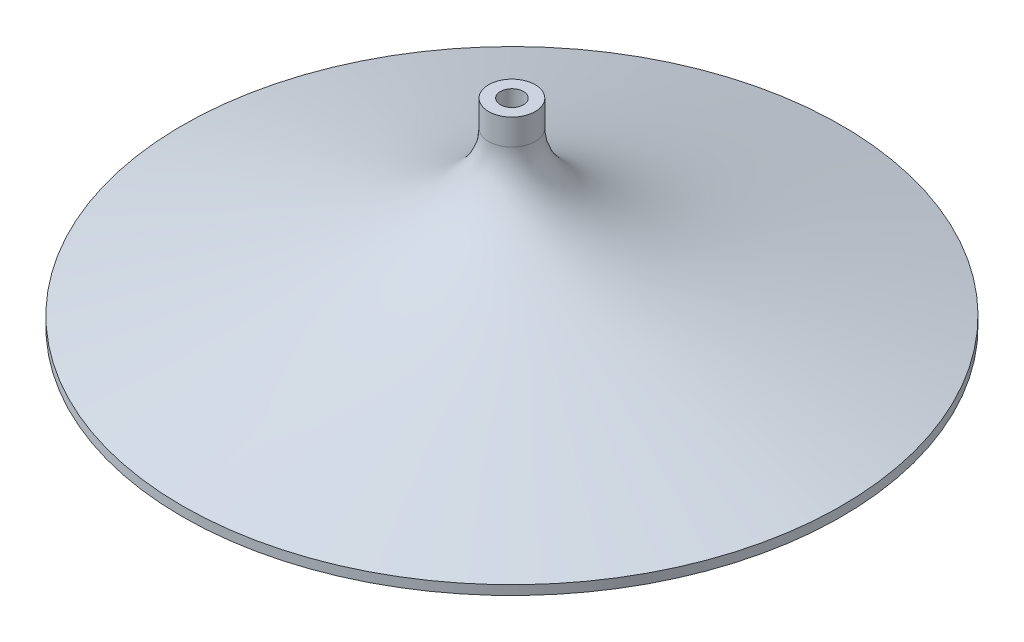
ISO-10303-21;
HEADER;
FILE_DESCRIPTION(('STEP AP214'),'2;1');
FILE_NAME('part.step','',(''),(''),'','','');
FILE_SCHEMA(('AUTOMOTIVE_DESIGN { 1 0 10303 214 1 1 1 1 }'));
ENDSEC;
DATA;
#1=APPLICATION_CONTEXT('core data for automotive mechanical design processes');
#2=APPLICATION_PROTOCOL_DEFINITION('international standard','automotive_design',2000,#1);
#3=PRODUCT_CONTEXT('',#1,'mechanical');
#4=PRODUCT('Part','Part','',(#3));
#5=PRODUCT_RELATED_PRODUCT_CATEGORY('part','',(#4));
#6=PRODUCT_DEFINITION_FORMATION('','',#4);
#7=PRODUCT_DEFINITION_CONTEXT('part definition',#1,'design');
#8=PRODUCT_DEFINITION('design','',#6,#7);
#9=PRODUCT_DEFINITION_SHAPE('','',#8);
#10=(LENGTH_UNIT() NAMED_UNIT(*) SI_UNIT(.MILLI.,.METRE.));
#11=(NAMED_UNIT(*) PLANE_ANGLE_UNIT() SI_UNIT($,.RADIAN.));
#12=(NAMED_UNIT(*) SI_UNIT($,.STERADIAN.) SOLID_ANGLE_UNIT());
#13=UNCERTAINTY_MEASURE_WITH_UNIT(LENGTH_MEASURE(1.E-05),#10,'distance_accuracy_value','');
#14=(GEOMETRIC_REPRESENTATION_CONTEXT(3) GLOBAL_UNCERTAINTY_ASSIGNED_CONTEXT((#13)) GLOBAL_UNIT_ASSIGNED_CONTEXT((#10,
#11,#12)) REPRESENTATION_CONTEXT('',''));
#15=CARTESIAN_POINT('',(0.,0.,0.));
#16=DIRECTION('',(0.,0.,1.));
#17=DIRECTION('',(1.,0.,0.));
#18=AXIS2_PLACEMENT_3D('',#15,#16,#17);
#19=CARTESIAN_POINT('',(3.5,41.1639123009446,0.));
#20=CARTESIAN_POINT('',(3.49999999999997,40.9287658009663,0.));
#21=CARTESIAN_POINT('',(9.43857005007433,32.1160632800598,0.));
#22=CARTESIAN_POINT('',(43.1197069964458,15.0735828836422,0.));
#23=CARTESIAN_POINT('',(90.3127625250122,0.,0.));
#24=CARTESIAN_POINT('',(100.,0.,0.));
#25=B_SPLINE_CURVE_WITH_KNOTS('',3,(#19,#20,#21,#22,#23,#24),.UNSPECIFIED.,.F.,.F.,(4,1,1,4),
(0.,0.258531262544246,0.358531262544246,1.),.UNSPECIFIED.);
#26=CARTESIAN_POINT('',(0.,82.9200333058916,0.));
#27=DIRECTION('',(0.,1.,0.));
#28=AXIS1_PLACEMENT('',#26,#27);
#29=SURFACE_OF_REVOLUTION('',#25,#28);
#30=CARTESIAN_POINT('',(0.,0.,0.));
#31=DIRECTION('',(0.,1.,0.));
#32=DIRECTION('',(0.,0.,1.));
#33=AXIS2_PLACEMENT_3D('',#30,#31,#32);
#34=CIRCLE('',#33,100.);
#35=CARTESIAN_POINT('',(0.,0.,100.));
#36=VERTEX_POINT('',#35);
#37=EDGE_CURVE('E44',#36,#36,#34,.T.);
#38=ORIENTED_EDGE('',*,*,#37,.F.);
#39=EDGE_LOOP('',(#38));
#40=FACE_BOUND('',#39,.T.);
#41=CARTESIAN_POINT('',(0.,41.1639123009446,0.));
#42=DIRECTION('',(0.,1.,0.));
#43=DIRECTION('',(0.,0.,1.));
#44=AXIS2_PLACEMENT_3D('',#41,#42,#43);
#45=CIRCLE('',#44,3.5);
#46=CARTESIAN_POINT('',(0.,41.1639123009446,3.5));
#47=VERTEX_POINT('',#46);
#48=EDGE_CURVE('E49',#47,#47,#45,.T.);
#49=ORIENTED_EDGE('',*,*,#48,.T.);
#50=EDGE_LOOP('',(#49));
#51=FACE_BOUND('',#50,.T.);
#52=CARTESIAN_POINT('',(-50.,7.74931137944669,47.));
#53=CARTESIAN_POINT('',(-49.8371933999192,7.78743607054464,47.0000070376987));
#54=CARTESIAN_POINT('',(-49.6736400864839,7.82278170177511,47.0132897353084));
#55=CARTESIAN_POINT('',(-49.3495140158562,7.88663733892453,47.066763295319));
#56=CARTESIAN_POINT('',(-49.1889432280433,7.91514296671415,47.1069713299351));
#57=CARTESIAN_POINT('',(-48.8752651920754,7.96421963684058,47.213881640766));
#58=CARTESIAN_POINT('',(-48.7221697942277,7.98477841686328,47.2806245420512));
#59=CARTESIAN_POINT('',(-48.4285050258245,8.01700531047959,47.4390964856618));
#60=CARTESIAN_POINT('',(-48.2879321049657,8.02867595111864,47.5308184159589));
#61=CARTESIAN_POINT('',(-48.0277796406657,8.04239333431842,47.7335670025724));
#62=CARTESIAN_POINT('',(-47.9076930782927,8.04472095070251,47.8439245601739));
#63=CARTESIAN_POINT('',(-47.6870571782945,8.04042487013625,48.0825297239788));
#64=CARTESIAN_POINT('',(-47.5865060945378,8.03380197362724,48.2107757295045));
#65=CARTESIAN_POINT('',(-47.4091170317056,8.01206614657978,48.4792064289043));
#66=CARTESIAN_POINT('',(-47.3319373859919,7.99708567306985,48.6191765966015));
#67=CARTESIAN_POINT('',(-47.2010226019104,7.95934104526324,48.9086839439501));
#68=CARTESIAN_POINT('',(-47.1472889343607,7.93657640280817,49.0582217231243));
#69=CARTESIAN_POINT('',(-47.0633645488106,7.88358413411348,49.3658729798267));
#70=CARTESIAN_POINT('',(-47.0336811680985,7.85321254479572,49.5240996166637));
#71=CARTESIAN_POINT('',(-46.9999017850467,7.78635127947534,49.8419700805924));
#72=CARTESIAN_POINT('',(-46.9958107561781,7.74986041570267,50.001614177109));
#73=CARTESIAN_POINT('',(-47.0131087052758,7.6701785173301,50.3255019234452));
#74=CARTESIAN_POINT('',(-47.0356580889196,7.62675914109373,50.4896271801748));
#75=CARTESIAN_POINT('',(-47.1069878497364,7.53590563625835,50.8109124802167));
#76=CARTESIAN_POINT('',(-47.1557745199752,7.48847054678329,50.9680708427128));
#77=CARTESIAN_POINT('',(-47.2808959547778,7.38857426018312,51.2790221345277));
#78=CARTESIAN_POINT('',(-47.3584530164055,7.33598085799161,51.4322813706433));
#79=CARTESIAN_POINT('',(-47.5382258039769,7.22939277170783,51.7230495062454));
#80=CARTESIAN_POINT('',(-47.6404462898835,7.17539781891807,51.8605553578143));
#81=CARTESIAN_POINT('',(-47.8702534856856,7.06581058147329,52.1201745317555));
#82=CARTESIAN_POINT('',(-47.9985227383986,7.01022016117296,52.2416855288685));
#83=CARTESIAN_POINT('',(-48.2748008670827,6.90065577384512,52.4606418789994));
#84=CARTESIAN_POINT('',(-48.4228108682062,6.84668189916985,52.5580858593797));
#85=CARTESIAN_POINT('',(-48.7346112136652,6.74182640087181,52.7258284834378));
#86=CARTESIAN_POINT('',(-48.8984089914099,6.69094625244589,52.7961142613542));
#87=CARTESIAN_POINT('',(-49.2370996249496,6.59376584644928,52.9068386477738));
#88=CARTESIAN_POINT('',(-49.4119910632492,6.54746500568341,52.9472810612118));
#89=CARTESIAN_POINT('',(-49.7626241552213,6.46205417794045,52.9956782508579));
#90=CARTESIAN_POINT('',(-49.9382029355796,6.42277830760406,53.004516499712));
#91=CARTESIAN_POINT('',(-50.2895867013484,6.35105173753287,52.9911579321347));
#92=CARTESIAN_POINT('',(-50.4653916177128,6.31859930108163,52.9689690238348));
#93=CARTESIAN_POINT('',(-50.8041517294162,6.26277740580056,52.8951861648044));
#94=CARTESIAN_POINT('',(-50.9673350705913,6.23907929180808,52.8448881780332));
#95=CARTESIAN_POINT('',(-51.2836000002297,6.19962880755189,52.7168823419498));
#96=CARTESIAN_POINT('',(-51.4366840865841,6.18387446606922,52.6391813007495));
#97=CARTESIAN_POINT('',(-51.7222394944673,6.16126085266228,52.4619209045582));
#98=CARTESIAN_POINT('',(-51.8552744769774,6.15408508895662,52.363308799744));
#99=CARTESIAN_POINT('',(-52.1034112005326,6.14777501579681,52.1454391095434));
#100=CARTESIAN_POINT('',(-52.2185154152126,6.14863959613816,52.0261843767066));
#101=CARTESIAN_POINT('',(-52.4254528736472,6.15828945824554,51.7729691789806));
#102=CARTESIAN_POINT('',(-52.5176804519469,6.16692656448727,51.6393248257427));
#103=CARTESIAN_POINT('',(-52.679173343367,6.19165734333051,51.3594600331875));
#104=CARTESIAN_POINT('',(-52.7484386985152,6.20775100228415,51.2132396168887));
#105=CARTESIAN_POINT('',(-52.8627846903166,6.24706062640485,50.9114187763394));
#106=CARTESIAN_POINT('',(-52.9077006836285,6.27032345006441,50.755762218745));
#107=CARTESIAN_POINT('',(-52.9718732136436,6.32328435205716,50.4403192114138));
#108=CARTESIAN_POINT('',(-52.9911267765077,6.35298317574975,50.2805322852242));
#109=CARTESIAN_POINT('',(-53.0041911898799,6.41896128838622,49.9565002467073));
#110=CARTESIAN_POINT('',(-52.9972524269038,6.45540562521037,49.7922594321927));
#111=CARTESIAN_POINT('',(-52.9569955960585,6.53333126899884,49.4681930891525));
#112=CARTESIAN_POINT('',(-52.9236725241946,6.5748135301821,49.3083684041323));
#113=CARTESIAN_POINT('',(-52.8540887721523,6.64087095188915,49.0719225319284));
#114=CARTESIAN_POINT('',(-52.8268815158635,6.66402646912765,48.9921184693883));
#115=CARTESIAN_POINT('',(-52.7659660377993,6.71126284305826,48.8353124880021));
#116=CARTESIAN_POINT('',(-52.7322590628655,6.73534352156828,48.7583100350851));
#117=CARTESIAN_POINT('',(-52.6586271444782,6.78427063236927,48.607615953116));
#118=CARTESIAN_POINT('',(-52.6187035461807,6.80911689807135,48.5339236122544));
#119=CARTESIAN_POINT('',(-52.5329168285918,6.85944005870036,48.3902338149446));
#120=CARTESIAN_POINT('',(-52.4870483297631,6.88491750768637,48.3202397868482));
#121=CARTESIAN_POINT('',(-52.3373349105849,6.96399073145484,48.11137758949));
#122=CARTESIAN_POINT('',(-52.2241604498708,7.01837898552972,47.9793331278455));
#123=CARTESIAN_POINT('',(-51.9768693618744,7.1276684991698,47.736819475004));
#124=CARTESIAN_POINT('',(-51.842750599346,7.18256981050346,47.6263524861916));
#125=CARTESIAN_POINT('',(-51.6272200652164,7.26470476951149,47.4780954056335));
#126=CARTESIAN_POINT('',(-51.5520951338072,7.29234318297422,47.4311767579379));
#127=CARTESIAN_POINT('',(-51.3979125673315,7.34713331196661,47.3441266400534));
#128=CARTESIAN_POINT('',(-51.3188584758221,7.37428543703709,47.3039891929116));
#129=CARTESIAN_POINT('',(-51.15736746953,7.42789371240121,47.2308205021526));
#130=CARTESIAN_POINT('',(-51.0749327063049,7.454350288292,47.1977848198416));
#131=CARTESIAN_POINT('',(-50.9072178854327,7.50636926606877,47.1390818573836));
#132=CARTESIAN_POINT('',(-50.8219378921303,7.53193168814921,47.1134144107306));
#133=CARTESIAN_POINT('',(-50.616102670703,7.59150430953714,47.061365572369));
#134=CARTESIAN_POINT('',(-50.4945046171052,7.62501587159943,47.0384493036012));
#135=CARTESIAN_POINT('',(-50.2487500434827,7.68933116788484,47.0077642955096));
#136=CARTESIAN_POINT('',(-50.124593683057,7.72013507039691,46.9999946141447));
#137=CARTESIAN_POINT('',(-50.,7.74931137944669,47.));
#138=B_SPLINE_CURVE_WITH_KNOTS('',3,(#52,#53,#54,#55,#56,#57,#58,#59,#60,#61,#62,#63,#64,#65,
#66,#67,#68,#69,#70,#71,#72,#73,#74,#75,#76,#77,#78,#79,#80,#81,#82,#83,#84,#85,#86,#87,#88,#89,
#90,#91,#92,#93,#94,#95,#96,#97,#98,#99,#100,#101,#102,#103,#104,#105,#106,#107,#108,#109,#110,
#111,#112,#113,#114,#115,#116,#117,#118,#119,#120,#121,#122,#123,#124,#125,#126,#127,#128,#129,
#130,#131,#132,#133,#134,#135,#136,#137),.UNSPECIFIED.,.T.,.F.,(4,2,2,2,2,2,2,2,2,2,2,2,2,2,2,2,
2,2,2,2,2,2,2,2,2,2,2,2,2,2,2,2,2,2,2,2,2,2,2,2,2,2,4),(0.,0.501213052798379,1.00274606987385,
1.5050499129044,2.00721088925107,2.49415726599421,2.98106009816822,3.46045679638913,
3.93988356390269,4.42917814841365,4.91856781667772,5.43008454748125,5.94172402135124,
6.47819982954571,7.01477925880777,7.56783565474552,8.12092358641026,8.67427321428396,
9.22755227963173,9.76523835019697,10.3027874015308,10.8173846225678,11.3318540852102,
11.8266915822709,12.321460753567,12.8069929164671,13.2925241906926,13.7812987874475,
14.2701300199414,14.7730560448954,15.2760774766364,15.5381425439692,15.8001573892586,
16.0621156182232,16.3243125700271,16.8682959232092,17.4123347710845,17.690408349697,
17.9682355408278,18.2458885782744,18.5235353408744,18.9071307511808,19.2907023030306),.UNSPECIFIED.);
#139=CARTESIAN_POINT('',(-50.,7.74931137944669,47.));
#140=VERTEX_POINT('',#139);
#141=EDGE_CURVE('E53',#140,#140,#138,.T.);
#142=ORIENTED_EDGE('',*,*,#141,.F.);
#143=EDGE_LOOP('',(#142));
#144=FACE_BOUND('',#143,.T.);
#145=CARTESIAN_POINT('',(50.,7.7493113794467,47.));
#146=CARTESIAN_POINT('',(50.1747667684297,7.70838254744763,47.000008455201));
#147=CARTESIAN_POINT('',(50.3489428781283,7.66418595198038,47.0153258446435));
#148=CARTESIAN_POINT('',(50.6909620175949,7.57088094981209,47.0754780929659));
#149=CARTESIAN_POINT('',(50.8587927892712,7.52176364443276,47.1203672777496));
#150=CARTESIAN_POINT('',(51.1830467747229,7.42036740942037,47.2377455024459));
#151=CARTESIAN_POINT('',(51.3394934924482,7.36809542657404,47.31017563604));
#152=CARTESIAN_POINT('',(51.637242243745,7.26186392397923,47.4803095734476));
#153=CARTESIAN_POINT('',(51.7785491241948,7.20790495149413,47.5780052543327));
#154=CARTESIAN_POINT('',(52.0459219903683,7.09833208547208,47.7988528847746));
#155=CARTESIAN_POINT('',(52.1714876297335,7.04271208306603,47.9226083440171));
#156=CARTESIAN_POINT('',(52.3993140935614,6.93277902294952,48.1905199566071));
#157=CARTESIAN_POINT('',(52.5015714736827,6.87846615945874,48.3346791199846));
#158=CARTESIAN_POINT('',(52.6799067021275,6.77245932078712,48.6400466282073));
#159=CARTESIAN_POINT('',(52.7558871173539,6.72077568587491,48.8013155881786));
#160=CARTESIAN_POINT('',(52.878389496379,6.62171840568605,49.1359369617584));
#161=CARTESIAN_POINT('',(52.924914861484,6.57434426331427,49.3092879776305));
#162=CARTESIAN_POINT('',(52.9856091901037,6.48646631843449,49.6583715734811));
#163=CARTESIAN_POINT('',(53.0005827722363,6.44581667820688,49.8339270199133));
#164=CARTESIAN_POINT('',(52.9993829507737,6.37116904873648,50.1863543438737));
#165=CARTESIAN_POINT('',(52.9832173423997,6.3371693971175,50.3632258808977));
#166=CARTESIAN_POINT('',(52.9208865040616,6.27817536706732,50.7052369922649));
#167=CARTESIAN_POINT('',(52.8760132016697,6.25286207088197,50.870556963971));
#168=CARTESIAN_POINT('',(52.7583262194443,6.21012128713429,51.1920189251059));
#169=CARTESIAN_POINT('',(52.6855196109414,6.19269180621138,51.3481632258334));
#170=CARTESIAN_POINT('',(52.5172652313949,6.16680373193512,51.6403271790651));
#171=CARTESIAN_POINT('',(52.4228223583421,6.15801879220589,51.7768972993104));
#172=CARTESIAN_POINT('',(52.212544115855,6.14851671982099,52.0327454205958));
#173=CARTESIAN_POINT('',(52.0967120042039,6.14779835957748,52.1520260500572));
#174=CARTESIAN_POINT('',(51.8497253108415,6.15437912850062,52.3674478446786));
#175=CARTESIAN_POINT('',(51.7189437299103,6.16151014904793,52.4640224677885));
#176=CARTESIAN_POINT('',(51.4439860896936,6.18330797209017,52.6345925359432));
#177=CARTESIAN_POINT('',(51.299810216223,6.19797467005769,52.7085882941569));
#178=CARTESIAN_POINT('',(51.0016061631091,6.2344930046678,52.8324840866406));
#179=CARTESIAN_POINT('',(50.8475391829702,6.25637452997317,52.8822817163447));
#180=CARTESIAN_POINT('',(50.5344411321874,6.30668872723654,52.9563936822727));
#181=CARTESIAN_POINT('',(50.3754095427275,6.3351220858749,52.9807053458965));
#182=CARTESIAN_POINT('',(50.0523436486466,6.39862850385429,53.0040290442243));
#183=CARTESIAN_POINT('',(49.8882902323577,6.43386014649554,53.0023400608364));
#184=CARTESIAN_POINT('',(49.5638193790384,6.50949708046443,52.9725922506907));
#185=CARTESIAN_POINT('',(49.4034026101037,6.54990331350464,52.9445286181602));
#186=CARTESIAN_POINT('',(49.0838910786966,6.63659506062347,52.8616544502913));
#187=CARTESIAN_POINT('',(48.9251111245444,6.68305207007709,52.8058098757514));
#188=CARTESIAN_POINT('',(48.6198859020658,6.77927275642507,52.668946777022));
#189=CARTESIAN_POINT('',(48.4734431904209,6.82903711490706,52.587923051118));
#190=CARTESIAN_POINT('',(48.1910010213732,6.93264564780772,52.3994721024694));
#191=CARTESIAN_POINT('',(48.0556441004194,6.98657334025611,52.291126959905));
#192=CARTESIAN_POINT('',(47.805686447347,7.09522694233373,52.052997252044));
#193=CARTESIAN_POINT('',(47.6910891508053,7.14995298246775,51.9232091448654));
#194=CARTESIAN_POINT('',(47.4834051194979,7.2599568698203,51.6425319540849));
#195=CARTESIAN_POINT('',(47.3908669600591,7.31521895384398,51.491230054281));
#196=CARTESIAN_POINT('',(47.233585836359,7.42337349657864,51.1740076953411));
#197=CARTESIAN_POINT('',(47.1688437080802,7.4762658839767,51.0080867967107));
#198=CARTESIAN_POINT('',(47.069839468038,7.57762280871161,50.6673922201839));
#199=CARTESIAN_POINT('',(47.0353742381982,7.62611486523826,50.4926859811529));
#200=CARTESIAN_POINT('',(46.9979111102729,7.71734319491259,50.138437045084));
#201=CARTESIAN_POINT('',(46.9949072640919,7.76008055453612,49.9588952686891));
#202=CARTESIAN_POINT('',(47.0207946217864,7.83663344417114,49.6072603025964));
#203=CARTESIAN_POINT('',(47.0484957871213,7.87072311803398,49.4351399297963));
#204=CARTESIAN_POINT('',(47.1338330637783,7.93056845057196,49.0969696040681));
#205=CARTESIAN_POINT('',(47.1914589174058,7.95632696012721,48.9309175918689));
#206=CARTESIAN_POINT('',(47.3316809418968,7.99724485326316,48.6187590869052));
#207=CARTESIAN_POINT('',(47.4128303186408,8.01288382399448,48.4720650884831));
#208=CARTESIAN_POINT('',(47.5988269294557,8.03491348133624,48.1938028500749));
#209=CARTESIAN_POINT('',(47.7036666980698,8.04130707671786,48.0622298647278));
#210=CARTESIAN_POINT('',(47.9294421284225,8.04449397016599,47.8231252551286));
#211=CARTESIAN_POINT('',(48.0495974251072,8.04164938827148,47.714860035955));
#212=CARTESIAN_POINT('',(48.305425667006,8.02727166971802,47.5192042386191));
#213=CARTESIAN_POINT('',(48.4411017471766,8.01573677511386,47.4318178887112));
#214=CARTESIAN_POINT('',(48.7232643826047,7.98453898018476,47.2805379371435));
#215=CARTESIAN_POINT('',(48.8696990257278,7.96491324342108,47.2165394115806));
#216=CARTESIAN_POINT('',(49.1696658373187,7.91832195661821,47.1128424615041));
#217=CARTESIAN_POINT('',(49.3231896811721,7.89136484232466,47.0731162778845));
#218=CARTESIAN_POINT('',(49.564634198632,7.84444338493509,47.0304557620372));
#219=CARTESIAN_POINT('',(49.6515718249299,7.82665147220695,47.0190208187454));
#220=CARTESIAN_POINT('',(49.8257218420074,7.78928043917538,47.0037910388814));
#221=CARTESIAN_POINT('',(49.9129342176214,7.76970141590419,46.999995787765));
#222=CARTESIAN_POINT('',(50.,7.7493113794467,47.));
#223=B_SPLINE_CURVE_WITH_KNOTS('',3,(#145,#146,#147,#148,#149,#150,#151,#152,#153,#154,#155,
#156,#157,#158,#159,#160,#161,#162,#163,#164,#165,#166,#167,#168,#169,#170,#171,#172,#173,#174,
#175,#176,#177,#178,#179,#180,#181,#182,#183,#184,#185,#186,#187,#188,#189,#190,#191,#192,#193,
#194,#195,#196,#197,#198,#199,#200,#201,#202,#203,#204,#205,#206,#207,#208,#209,#210,#211,#212,
#213,#214,#215,#216,#217,#218,#219,#220,#221,#222),.UNSPECIFIED.,.T.,.F.,(4,2,2,2,2,2,2,2,2,2,2,
2,2,2,2,2,2,2,2,2,2,2,2,2,2,2,2,2,2,2,2,2,2,2,2,2,2,2,4),(0.,0.538144826140719,1.07728103737207,
1.61527053804346,2.15308728847935,2.70509058972405,3.2571754095828,3.81128590759263,
4.36533240831263,4.90506984913645,5.44467219248547,5.96155226299459,6.47830157129723,
6.97469434165276,7.47101156896193,7.95690252186998,8.44278673516408,8.93070964211363,
9.41868371025408,9.91983683546959,10.421081294416,10.9425610550852,11.4641486189982,
12.0063753813257,12.5486917966874,13.1033438565081,13.6580125966579,14.2089311817358,
14.7597456081542,15.2899358289865,15.8199444291196,16.3225207227517,16.8249388618796,
17.3079043610925,17.7909675846279,18.2718362540317,18.7521539426954,19.0202629392438,
19.288357387301),.UNSPECIFIED.);
#224=CARTESIAN_POINT('',(50.,7.7493113794467,47.));
#225=VERTEX_POINT('',#224);
#226=EDGE_CURVE('E61',#225,#225,#223,.T.);
#227=ORIENTED_EDGE('',*,*,#226,.F.);
#228=EDGE_LOOP('',(#227));
#229=FACE_BOUND('',#228,.T.);
#230=CARTESIAN_POINT('',(49.9999999999997,6.41064462199854,-53.));
#231=CARTESIAN_POINT('',(50.1634225291492,6.37590807711266,-52.9999922921613));
#232=CARTESIAN_POINT('',(50.3275479154709,6.34400083899074,-52.9866054988192));
#233=CARTESIAN_POINT('',(50.6525927636919,6.28675220878911,-52.9327968603186));
#234=CARTESIAN_POINT('',(50.8135098028635,6.26141561707004,-52.8923553263786));
#235=CARTESIAN_POINT('',(51.1275251295454,6.21804261276954,-52.7850017518029));
#236=CARTESIAN_POINT('',(51.2806152428631,6.20001370128831,-52.7180626508272));
#237=CARTESIAN_POINT('',(51.5740783005077,6.17185406464985,-52.5593159386341));
#238=CARTESIAN_POINT('',(51.7144542941551,6.16172144121125,-52.4675143115665));
#239=CARTESIAN_POINT('',(51.9752286549594,6.14980114895252,-52.2638970406924));
#240=CARTESIAN_POINT('',(52.0960016230294,6.14783305474838,-52.1525714433463));
#241=CARTESIAN_POINT('',(52.3177153359826,6.15180617042391,-51.9117984470763));
#242=CARTESIAN_POINT('',(52.4186573028115,6.15774689280301,-51.7823521655539));
#243=CARTESIAN_POINT('',(52.5969528115745,6.17725113740893,-51.5106188387372));
#244=CARTESIAN_POINT('',(52.6745435963128,6.19073371507005,-51.3684813955105));
#245=CARTESIAN_POINT('',(52.8056641057531,6.2248680364192,-51.0743291871089));
#246=CARTESIAN_POINT('',(52.8591929322321,6.24552004768827,-50.9223140534462));
#247=CARTESIAN_POINT('',(52.9417314526904,6.29376262661139,-50.6104226223553));
#248=CARTESIAN_POINT('',(52.9703733318404,6.32144971237671,-50.4504641626842));
#249=CARTESIAN_POINT('',(53.0015621267547,6.38284684785618,-50.1291795914688));
#250=CARTESIAN_POINT('',(53.0041053253652,6.41655775482875,-49.9678532883815));
#251=CARTESIAN_POINT('',(52.9832361396604,6.49036982589213,-49.6425677289396));
#252=CARTESIAN_POINT('',(52.9589357460129,6.53064969315653,-49.4787062700501));
#253=CARTESIAN_POINT('',(52.8841947849241,6.61566701690998,-49.1582729653907));
#254=CARTESIAN_POINT('',(52.8337489859704,6.660405364062,-49.0017025853505));
#255=CARTESIAN_POINT('',(52.7058638953489,6.75518155843769,-48.6933601897619));
#256=CARTESIAN_POINT('',(52.6273810575099,6.80536298521645,-48.5420649542647));
#257=CARTESIAN_POINT('',(52.4464667401916,6.90806349053455,-48.2554253218611));
#258=CARTESIAN_POINT('',(52.344030515418,6.96058303059537,-48.1200840935301));
#259=CARTESIAN_POINT('',(52.1141985994346,7.06844729438541,-47.8644176192505));
#260=CARTESIAN_POINT('',(51.9860652541747,7.12382704313385,-47.7447694436418));
#261=CARTESIAN_POINT('',(51.7108293851384,7.23412272133619,-47.5294533686839));
#262=CARTESIAN_POINT('',(51.5637245555654,7.28903859354462,-47.4337883884227));
#263=CARTESIAN_POINT('',(51.2527335627108,7.39743237707183,-47.2683283020841));
#264=CARTESIAN_POINT('',(51.0886747855917,7.45088667366547,-47.1988414321605));
#265=CARTESIAN_POINT('',(50.7497480675867,7.55398016087717,-47.0897488107115));
#266=CARTESIAN_POINT('',(50.5748807319765,7.60361956477933,-47.0501413875844));
#267=CARTESIAN_POINT('',(50.2230463356254,7.69636420049075,-47.0031514674689));
#268=CARTESIAN_POINT('',(50.0461955720675,7.7395824076344,-46.9951257813196));
#269=CARTESIAN_POINT('',(49.6922776829214,7.81901325779093,-47.0105766138363));
#270=CARTESIAN_POINT('',(49.5152106312128,7.85522784641245,-47.0340443691849));
#271=CARTESIAN_POINT('',(49.1747010515462,7.9176167252325,-47.1107240665286));
#272=CARTESIAN_POINT('',(49.0110076535077,7.94417912930651,-47.1625043369528));
#273=CARTESIAN_POINT('',(48.6938653195417,7.98836922741689,-47.2938153017));
#274=CARTESIAN_POINT('',(48.5404129065754,8.00599996748677,-47.3733365196719));
#275=CARTESIAN_POINT('',(48.2561333833027,8.03087300728261,-47.5534045355803));
#276=CARTESIAN_POINT('',(48.1245612961922,8.03858752537287,-47.6527117380442));
#277=CARTESIAN_POINT('',(47.8793505974805,8.04486672164719,-47.8716564795552));
#278=CARTESIAN_POINT('',(47.7657086174572,8.0434331205361,-47.9912901911908));
#279=CARTESIAN_POINT('',(47.5624159646463,8.03164058962183,-48.2439259251785));
#280=CARTESIAN_POINT('',(47.4722190502732,8.02151433397063,-48.3765002683347));
#281=CARTESIAN_POINT('',(47.3143530309203,7.99307341491962,-48.6536227417015));
#282=CARTESIAN_POINT('',(47.2466842469561,7.97475863484575,-48.7981710424988));
#283=CARTESIAN_POINT('',(47.134741917246,7.93043478388578,-49.0966850351765));
#284=CARTESIAN_POINT('',(47.0907216416025,7.90434689513655,-49.2507337142543));
#285=CARTESIAN_POINT('',(47.02779046271,7.84552331372831,-49.5626323339673));
#286=CARTESIAN_POINT('',(47.0088837550745,7.81278651131746,-49.7204829052842));
#287=CARTESIAN_POINT('',(46.9958067228631,7.74035822588793,-50.0422315315141));
#288=CARTESIAN_POINT('',(47.0026558924077,7.70044096953791,-50.2061189779785));
#289=CARTESIAN_POINT('',(47.0426089651648,7.61590429637032,-50.529495985963));
#290=CARTESIAN_POINT('',(47.0757191064728,7.57128376450916,-50.6889844932326));
#291=CARTESIAN_POINT('',(47.1451361715435,7.50071628083566,-50.9257410353368));
#292=CARTESIAN_POINT('',(47.1724704006694,7.47595576728239,-51.0061116805839));
#293=CARTESIAN_POINT('',(47.2337492941704,7.42569612924651,-51.1640546496499));
#294=CARTESIAN_POINT('',(47.2676926677861,7.40019714981198,-51.2416275163717));
#295=CARTESIAN_POINT('',(47.3419186367934,7.34865123240374,-51.3934644578296));
#296=CARTESIAN_POINT('',(47.3821998518874,7.32260441480944,-51.4677292485124));
#297=CARTESIAN_POINT('',(47.4688374820343,7.27011997561127,-51.6125602643532));
#298=CARTESIAN_POINT('',(47.5151996334587,7.24368200617771,-51.6831229080272));
#299=CARTESIAN_POINT('',(47.6665701238843,7.16210548965184,-51.8935809607233));
#300=CARTESIAN_POINT('',(47.7811313246067,7.10660755830974,-52.0266368281718));
#301=CARTESIAN_POINT('',(48.0318549767822,6.99633122212031,-52.270910878108));
#302=CARTESIAN_POINT('',(48.1680176204942,6.94155282368173,-52.3821288662128));
#303=CARTESIAN_POINT('',(48.3863286883513,6.86080261233116,-52.5306030766662));
#304=CARTESIAN_POINT('',(48.4619234038781,6.83397080875972,-52.5772515834185));
#305=CARTESIAN_POINT('',(48.6171043500921,6.7810786378587,-52.6637331674393));
#306=CARTESIAN_POINT('',(48.6966870153652,6.75501761343762,-52.7035721969215));
#307=CARTESIAN_POINT('',(48.8592697913629,6.70385522916287,-52.7760859011899));
#308=CARTESIAN_POINT('',(48.9422673089652,6.67875316805412,-52.808765897246));
#309=CARTESIAN_POINT('',(49.1111288982836,6.62967215360121,-52.8666841883208));
#310=CARTESIAN_POINT('',(49.1969928307289,6.60569314582678,-52.8919228443084));
#311=CARTESIAN_POINT('',(49.4003835064132,6.55114582238006,-52.9419056274775));
#312=CARTESIAN_POINT('',(49.5188126030611,6.52108621729534,-52.9636057398951));
#313=CARTESIAN_POINT('',(49.7580324021791,6.46371417968924,-52.9926554071486));
#314=CARTESIAN_POINT('',(49.8788229803391,6.43640160302485,-53.0000057153254));
#315=CARTESIAN_POINT('',(49.9999999999997,6.41064462199854,-53.));
#316=B_SPLINE_CURVE_WITH_KNOTS('',3,(#230,#231,#232,#233,#234,#235,#236,#237,#238,#239,#240,
#241,#242,#243,#244,#245,#246,#247,#248,#249,#250,#251,#252,#253,#254,#255,#256,#257,#258,#259,
#260,#261,#262,#263,#264,#265,#266,#267,#268,#269,#270,#271,#272,#273,#274,#275,#276,#277,#278,
#279,#280,#281,#282,#283,#284,#285,#286,#287,#288,#289,#290,#291,#292,#293,#294,#295,#296,#297,
#298,#299,#300,#301,#302,#303,#304,#305,#306,#307,#308,#309,#310,#311,#312,#313,#314,#315),
.UNSPECIFIED.,.T.,.F.,(4,2,2,2,2,2,2,2,2,2,2,2,2,2,2,2,2,2,2,2,2,2,2,2,2,2,2,2,2,2,2,2,2,2,2,2,
2,2,2,2,2,2,4),(0.,0.500807514720076,1.0019798834862,1.50366539477514,2.00523026275769,
2.49565015249059,2.9860398140713,3.47126454775651,3.95650739318026,4.44880548400798,
4.94117369034358,5.45033102497369,5.95959027777388,6.4902116986955,7.02093832774811,
7.56992987464551,8.11898820903748,8.6743231676687,9.22962705585529,9.77356131023345,
10.3173442416666,10.835878335257,11.3542354699609,11.8468625198108,12.3393969122792,
12.8191447570447,13.2988994377064,13.7836946282305,14.2685708011766,14.7728381061237,
15.2772252318461,15.5422651532336,15.8072533644117,16.0721839443628,16.3373662651343,
16.8870658949041,17.4367704174301,17.7148652982233,17.992715837133,18.2703591452027,
18.5479889829698,18.9193548439612,19.2907012083407),.UNSPECIFIED.);
#317=CARTESIAN_POINT('',(49.9999999999997,6.41064462199854,-53.));
#318=VERTEX_POINT('',#317);
#319=EDGE_CURVE('E110',#318,#318,#316,.T.);
#320=ORIENTED_EDGE('',*,*,#319,.F.);
#321=EDGE_LOOP('',(#320));
#322=FACE_BOUND('',#321,.T.);
#323=CARTESIAN_POINT('',(-50.0000000000003,6.4106446219984,-53.));
#324=CARTESIAN_POINT('',(-49.8264166131485,6.44754476625399,-52.9999911787504));
#325=CARTESIAN_POINT('',(-49.6533561331935,6.48769685441068,-52.9848777019831));
#326=CARTESIAN_POINT('',(-49.3134822522464,6.5733210117096,-52.9255010802326));
#327=CARTESIAN_POINT('',(-49.1466803479975,6.61880229381617,-52.8811868237543));
#328=CARTESIAN_POINT('',(-48.8244357129702,6.71369394305656,-52.7653723199368));
#329=CARTESIAN_POINT('',(-48.6689692374573,6.76309561615191,-52.6939309680249));
#330=CARTESIAN_POINT('',(-48.3730948298674,6.8645934068584,-52.5262811936565));
#331=CARTESIAN_POINT('',(-48.2326826299133,6.91668875457347,-52.4300798170911));
#332=CARTESIAN_POINT('',(-47.966611509077,7.02377300040608,-52.212619632008));
#333=CARTESIAN_POINT('',(-47.8414907057245,7.0788020369729,-52.090721735801));
#334=CARTESIAN_POINT('',(-47.6141967137642,7.18882394626176,-51.8270867299255));
#335=CARTESIAN_POINT('',(-47.5120281449176,7.24381680948597,-51.6853456355761));
#336=CARTESIAN_POINT('',(-47.3321927403487,7.3530433075912,-51.3835220384364));
#337=CARTESIAN_POINT('',(-47.2549284491817,7.40725212057162,-51.2231901943248));
#338=CARTESIAN_POINT('',(-47.1296777156294,7.51232680150392,-50.8904209515716));
#339=CARTESIAN_POINT('',(-47.0816904098923,7.56319276799384,-50.7179839100685));
#340=CARTESIAN_POINT('',(-47.0175460892805,7.65905539589707,-50.3687535831859));
#341=CARTESIAN_POINT('',(-47.0008906330226,7.70413314622739,-50.1920746118516));
#342=CARTESIAN_POINT('',(-46.9991797419105,7.78766855665532,-49.8369857735015));
#343=CARTESIAN_POINT('',(-47.0141162520197,7.82612790155095,-49.658576359244));
#344=CARTESIAN_POINT('',(-47.074588652209,7.89330538516556,-49.3134880739381));
#345=CARTESIAN_POINT('',(-47.1187521442244,7.92237710333046,-49.1466381013856));
#346=CARTESIAN_POINT('',(-47.2356250815919,7.97174609108305,-48.8218738944515));
#347=CARTESIAN_POINT('',(-47.3083246449253,7.99204639309812,-48.6639565883311));
#348=CARTESIAN_POINT('',(-47.4760302114547,8.02214417143274,-48.3700490612077));
#349=CARTESIAN_POINT('',(-47.5697123108225,8.03242369145099,-48.2333518547284));
#350=CARTESIAN_POINT('',(-47.7785282072235,8.04377542968694,-47.9770394941084));
#351=CARTESIAN_POINT('',(-47.8936573476987,8.04484964417541,-47.857420641874));
#352=CARTESIAN_POINT('',(-48.1380923648599,8.03785521265689,-47.6422444563365));
#353=CARTESIAN_POINT('',(-48.2668605945423,8.03006363536848,-47.5460659806634));
#354=CARTESIAN_POINT('',(-48.5375085798301,8.00611750339077,-47.3757509164604));
#355=CARTESIAN_POINT('',(-48.679388197986,7.98996303636325,-47.3016140968975));
#356=CARTESIAN_POINT('',(-48.9729731742041,7.94983409696214,-47.1767381693606));
#357=CARTESIAN_POINT('',(-49.1247284964464,7.92581690484519,-47.1261306200743));
#358=CARTESIAN_POINT('',(-49.4331481523763,7.87090049408647,-47.0497574095453));
#359=CARTESIAN_POINT('',(-49.5898132158206,7.84000024817701,-47.0239954594688));
#360=CARTESIAN_POINT('',(-49.9097919036424,7.77113500732837,-46.9969043844122));
#361=CARTESIAN_POINT('',(-50.0731373655416,7.73295122447824,-46.996512859553));
#362=CARTESIAN_POINT('',(-50.3965120493658,7.65160811619706,-47.0218962621896));
#363=CARTESIAN_POINT('',(-50.5565404960594,7.60844764277545,-47.0476772377338));
#364=CARTESIAN_POINT('',(-50.8772375685444,7.51619615111021,-47.1261452511297));
#365=CARTESIAN_POINT('',(-51.0375392138707,7.46691662078478,-47.1801114253215));
#366=CARTESIAN_POINT('',(-51.3461813110518,7.36577333007467,-47.3137214444474));
#367=CARTESIAN_POINT('',(-51.4945190702027,7.31390899215525,-47.3933710498848));
#368=CARTESIAN_POINT('',(-51.7812716214868,7.20689142153874,-47.5797769714391));
#369=CARTESIAN_POINT('',(-51.9190399823695,7.15169011078726,-47.6875016309144));
#370=CARTESIAN_POINT('',(-52.1739061252151,7.04158196166815,-47.9252677890638));
#371=CARTESIAN_POINT('',(-52.291001304306,6.9866751612237,-48.0553120938499));
#372=CARTESIAN_POINT('',(-52.5026306280742,6.87788942102446,-48.3362119433516));
#373=CARTESIAN_POINT('',(-52.5968232298659,6.8240359053292,-48.4873351735944));
#374=CARTESIAN_POINT('',(-52.7573723127684,6.71968800296381,-48.8047892583645));
#375=CARTESIAN_POINT('',(-52.823730173399,6.66919344992426,-48.9711193587252));
#376=CARTESIAN_POINT('',(-52.9251770657376,6.57384543044801,-49.3113024477337));
#377=CARTESIAN_POINT('',(-52.9607790928348,6.52891057695859,-49.48497920403));
#378=CARTESIAN_POINT('',(-53.0008246187109,6.44502908792063,-49.8373179150081));
#379=CARTESIAN_POINT('',(-53.0052747362355,6.4060811820647,-50.015978802628));
#380=CARTESIAN_POINT('',(-52.9825740460102,6.33676323314996,-50.3657466919221));
#381=CARTESIAN_POINT('',(-52.9566409954726,6.30611929778934,-50.5368781556154));
#382=CARTESIAN_POINT('',(-52.875303864456,6.2524384814088,-50.8732350180868));
#383=CARTESIAN_POINT('',(-52.8199076008262,6.2293995853314,-51.038461970981));
#384=CARTESIAN_POINT('',(-52.6838417235302,6.19247569158717,-51.3508468641971));
#385=CARTESIAN_POINT('',(-52.6043412519586,6.17824447660105,-51.4984736156395));
#386=CARTESIAN_POINT('',(-52.4215481730948,6.15788730506765,-51.7787867485624));
#387=CARTESIAN_POINT('',(-52.3182612136393,6.15175942679826,-51.9114766655109));
#388=CARTESIAN_POINT('',(-52.0941603102193,6.14785611429734,-52.1543022714111));
#389=CARTESIAN_POINT('',(-51.9739280542659,6.14984820292078,-52.2649718724094));
#390=CARTESIAN_POINT('',(-51.7173150415417,6.1616031360501,-52.4652209783766));
#391=CARTESIAN_POINT('',(-51.5809309010849,6.17136761126645,-52.5547960524296));
#392=CARTESIAN_POINT('',(-51.2966138526935,6.19832087239261,-52.7101575498894));
#393=CARTESIAN_POINT('',(-51.1487265343415,6.21548146291786,-52.7760325897646));
#394=CARTESIAN_POINT('',(-50.8452997299801,6.25671676149541,-52.8829301556884));
#395=CARTESIAN_POINT('',(-50.6897696668492,6.28078312416593,-52.9239824941423));
#396=CARTESIAN_POINT('',(-50.4444314219283,6.32319756327055,-52.9682547235822));
#397=CARTESIAN_POINT('',(-50.3557280341354,6.33942161888492,-52.9801709741051));
#398=CARTESIAN_POINT('',(-50.1779706848648,6.37369428286808,-52.996045695102));
#399=CARTESIAN_POINT('',(-50.0889167391158,6.39174281025476,-53.0000045186165));
#400=CARTESIAN_POINT('',(-50.0000000000003,6.4106446219984,-53.));
#401=B_SPLINE_CURVE_WITH_KNOTS('',3,(#323,#324,#325,#326,#327,#328,#329,#330,#331,#332,#333,
#334,#335,#336,#337,#338,#339,#340,#341,#342,#343,#344,#345,#346,#347,#348,#349,#350,#351,#352,
#353,#354,#355,#356,#357,#358,#359,#360,#361,#362,#363,#364,#365,#366,#367,#368,#369,#370,#371,
#372,#373,#374,#375,#376,#377,#378,#379,#380,#381,#382,#383,#384,#385,#386,#387,#388,#389,#390,
#391,#392,#393,#394,#395,#396,#397,#398,#399,#400),.UNSPECIFIED.,.T.,.F.,(4,2,2,2,2,2,2,2,2,2,2,
2,2,2,2,2,2,2,2,2,2,2,2,2,2,2,2,2,2,2,2,2,2,2,2,2,2,2,4),(0.,0.532039412785759,1.06501256163863,
1.59683513219686,2.1285065304959,2.67541457218218,3.22243259554945,3.77789423263192,
4.333339488862,4.87987118985208,5.4262635578842,5.94866417292939,6.47088404043433,
6.96652018700832,7.46204884676419,7.94250696622628,8.42296004951538,8.90606809752623,
9.38924829580843,9.89027529452176,10.3914180989634,10.9175827318706,11.4438654597392,
11.9914923751689,12.5391881908724,13.094609749222,13.6500037770272,14.1959445678585,
14.7417693608899,15.2664451285899,15.7909817645879,16.293313704596,16.7955264942266,
17.2834632496978,17.7715024052961,18.2576972954534,18.7433070929996,19.015852233994,
19.2883852829442),.UNSPECIFIED.);
#402=CARTESIAN_POINT('',(-50.0000000000003,6.4106446219984,-53.));
#403=VERTEX_POINT('',#402);
#404=EDGE_CURVE('E36',#403,#403,#401,.T.);
#405=ORIENTED_EDGE('',*,*,#404,.F.);
#406=EDGE_LOOP('',(#405));
#407=FACE_BOUND('',#406,.T.);
#408=ADVANCED_FACE('F31',(#40,#51,#144,#229,#322,#407),#29,.T.);
#409=CARTESIAN_POINT('',(100.,2.84447733625825,0.));
#410=CARTESIAN_POINT('',(58.2634484689816,15.9060116245929,0.));
#411=CARTESIAN_POINT('',(27.9536063970779,25.1951255615842,0.));
#412=CARTESIAN_POINT('',(7.05728807209809,41.214411439742,0.));
#413=CARTESIAN_POINT('',(7.05728807209812,52.1250087450727,0.));
#414=B_SPLINE_CURVE_WITH_KNOTS('',3,(#409,#410,#411,#412,#413),.UNSPECIFIED.,.F.,.F.,(4,1,4),
(0.,0.525870121604246,1.),.UNSPECIFIED.);
#415=CARTESIAN_POINT('',(0.,82.9200333058916,0.));
#416=DIRECTION('',(0.,1.,0.));
#417=AXIS1_PLACEMENT('',#415,#416);
#418=SURFACE_OF_REVOLUTION('',#414,#417);
#419=CARTESIAN_POINT('',(0.,52.1250087450727,0.));
#420=DIRECTION('',(0.,1.,0.));
#421=DIRECTION('',(0.,0.,1.));
#422=AXIS2_PLACEMENT_3D('',#419,#420,#421);
#423=CIRCLE('',#422,7.05728807209811);
#424=CARTESIAN_POINT('',(0.,52.1250087450727,7.05728807209811));
#425=VERTEX_POINT('',#424);
#426=EDGE_CURVE('E59',#425,#425,#423,.T.);
#427=ORIENTED_EDGE('',*,*,#426,.F.);
#428=EDGE_LOOP('',(#427));
#429=FACE_BOUND('',#428,.T.);
#430=CARTESIAN_POINT('',(0.,2.84447733625826,0.));
#431=DIRECTION('',(0.,1.,0.));
#432=DIRECTION('',(0.,0.,1.));
#433=AXIS2_PLACEMENT_3D('',#430,#431,#432);
#434=CIRCLE('',#433,100.);
#435=CARTESIAN_POINT('',(0.,2.84447733625826,100.));
#436=VERTEX_POINT('',#435);
#437=EDGE_CURVE('E10',#436,#436,#434,.T.);
#438=ORIENTED_EDGE('',*,*,#437,.T.);
#439=EDGE_LOOP('',(#438));
#440=FACE_BOUND('',#439,.T.);
#441=ADVANCED_FACE('F33',(#429,#440),#418,.T.);
#442=CARTESIAN_POINT('',(0.,82.9200333058916,0.));
#443=DIRECTION('',(0.,1.,0.));
#444=DIRECTION('',(0.,0.,1.));
#445=AXIS2_PLACEMENT_3D('',#442,#443,#444);
#446=CYLINDRICAL_SURFACE('',#445,100.);
#447=ORIENTED_EDGE('',*,*,#437,.F.);
#448=EDGE_LOOP('',(#447));
#449=FACE_BOUND('',#448,.T.);
#450=ORIENTED_EDGE('',*,*,#37,.T.);
#451=EDGE_LOOP('',(#450));
#452=FACE_BOUND('',#451,.T.);
#453=ADVANCED_FACE('F84',(#449,#452),#446,.T.);
#454=CARTESIAN_POINT('',(0.,82.9200333058916,0.));
#455=DIRECTION('',(0.,1.,0.));
#456=DIRECTION('',(0.,0.,1.));
#457=AXIS2_PLACEMENT_3D('',#454,#455,#456);
#458=CYLINDRICAL_SURFACE('',#457,3.5);
#459=ORIENTED_EDGE('',*,*,#48,.F.);
#460=EDGE_LOOP('',(#459));
#461=FACE_BOUND('',#460,.T.);
#462=CARTESIAN_POINT('',(0.,60.,0.));
#463=DIRECTION('',(0.,1.,0.));
#464=DIRECTION('',(0.,0.,1.));
#465=AXIS2_PLACEMENT_3D('',#462,#463,#464);
#466=CIRCLE('',#465,3.5);
#467=CARTESIAN_POINT('',(0.,60.,3.5));
#468=VERTEX_POINT('',#467);
#469=EDGE_CURVE('E145',#468,#468,#466,.T.);
#470=ORIENTED_EDGE('',*,*,#469,.T.);
#471=EDGE_LOOP('',(#470));
#472=FACE_BOUND('',#471,.T.);
#473=ADVANCED_FACE('F81',(#461,#472),#458,.F.);
#474=CARTESIAN_POINT('',(7.05728807209811,60.,0.));
#475=DIRECTION('',(0.,-1.,0.));
#476=DIRECTION('',(0.,0.,-1.));
#477=AXIS2_PLACEMENT_3D('',#474,#475,#476);
#478=PLANE('',#477);
#479=ORIENTED_EDGE('',*,*,#469,.F.);
#480=EDGE_LOOP('',(#479));
#481=FACE_BOUND('',#480,.T.);
#482=CARTESIAN_POINT('',(0.,60.,0.));
#483=DIRECTION('',(0.,1.,0.));
#484=DIRECTION('',(0.,0.,1.));
#485=AXIS2_PLACEMENT_3D('',#482,#483,#484);
#486=CIRCLE('',#485,7.05728807209811);
#487=CARTESIAN_POINT('',(0.,60.,7.05728807209811));
#488=VERTEX_POINT('',#487);
#489=EDGE_CURVE('E142',#488,#488,#486,.T.);
#490=ORIENTED_EDGE('',*,*,#489,.T.);
#491=EDGE_LOOP('',(#490));
#492=FACE_BOUND('',#491,.T.);
#493=ADVANCED_FACE('F78',(#481,#492),#478,.F.);
#494=CARTESIAN_POINT('',(0.,82.9200333058916,0.));
#495=DIRECTION('',(0.,1.,0.));
#496=DIRECTION('',(0.,0.,1.));
#497=AXIS2_PLACEMENT_3D('',#494,#495,#496);
#498=CYLINDRICAL_SURFACE('',#497,7.05728807209811);
#499=ORIENTED_EDGE('',*,*,#489,.F.);
#500=EDGE_LOOP('',(#499));
#501=FACE_BOUND('',#500,.T.);
#502=ORIENTED_EDGE('',*,*,#426,.T.);
#503=EDGE_LOOP('',(#502));
#504=FACE_BOUND('',#503,.T.);
#505=ADVANCED_FACE('F74',(#501,#504),#498,.T.);
#506=CARTESIAN_POINT('',(-50.,10.,50.));
#507=DIRECTION('',(0.,-1.,0.));
#508=DIRECTION('',(0.,0.,-1.));
#509=AXIS2_PLACEMENT_3D('',#506,#507,#508);
#510=CYLINDRICAL_SURFACE('',#509,3.);
#511=CARTESIAN_POINT('',(-50.,10.,50.));
#512=DIRECTION('',(0.,1.,0.));
#513=DIRECTION('',(0.,0.,1.));
#514=AXIS2_PLACEMENT_3D('',#511,#512,#513);
#515=CIRCLE('',#514,3.);
#516=CARTESIAN_POINT('',(-50.,10.,53.));
#517=VERTEX_POINT('',#516);
#518=EDGE_CURVE('E60',#517,#517,#515,.T.);
#519=ORIENTED_EDGE('',*,*,#518,.T.);
#520=EDGE_LOOP('',(#519));
#521=FACE_BOUND('',#520,.T.);
#522=ORIENTED_EDGE('',*,*,#141,.T.);
#523=EDGE_LOOP('',(#522));
#524=FACE_BOUND('',#523,.T.);
#525=ADVANCED_FACE('F68',(#521,#524),#510,.F.);
#526=CARTESIAN_POINT('',(-50.,10.,50.));
#527=DIRECTION('',(0.,1.,0.));
#528=DIRECTION('',(0.,0.,1.));
#529=AXIS2_PLACEMENT_3D('',#526,#527,#528);
#530=PLANE('',#529);
#531=ORIENTED_EDGE('',*,*,#518,.F.);
#532=EDGE_LOOP('',(#531));
#533=FACE_BOUND('',#532,.T.);
#534=ADVANCED_FACE('F73',(#533),#530,.F.);
#535=CARTESIAN_POINT('',(50.,10.,50.));
#536=DIRECTION('',(0.,-1.,0.));
#537=DIRECTION('',(0.,0.,-1.));
#538=AXIS2_PLACEMENT_3D('',#535,#536,#537);
#539=CYLINDRICAL_SURFACE('',#538,3.);
#540=CARTESIAN_POINT('',(50.,10.,50.));
#541=DIRECTION('',(0.,1.,0.));
#542=DIRECTION('',(0.,0.,1.));
#543=AXIS2_PLACEMENT_3D('',#540,#541,#542);
#544=CIRCLE('',#543,3.);
#545=CARTESIAN_POINT('',(50.,10.,53.));
#546=VERTEX_POINT('',#545);
#547=EDGE_CURVE('E123',#546,#546,#544,.T.);
#548=ORIENTED_EDGE('',*,*,#547,.T.);
#549=EDGE_LOOP('',(#548));
#550=FACE_BOUND('',#549,.T.);
#551=ORIENTED_EDGE('',*,*,#226,.T.);
#552=EDGE_LOOP('',(#551));
#553=FACE_BOUND('',#552,.T.);
#554=ADVANCED_FACE('F154',(#550,#553),#539,.F.);
#555=CARTESIAN_POINT('',(50.,10.,50.));
#556=DIRECTION('',(0.,1.,0.));
#557=DIRECTION('',(0.,0.,1.));
#558=AXIS2_PLACEMENT_3D('',#555,#556,#557);
#559=PLANE('',#558);
#560=ORIENTED_EDGE('',*,*,#547,.F.);
#561=EDGE_LOOP('',(#560));
#562=FACE_BOUND('',#561,.T.);
#563=ADVANCED_FACE('F156',(#562),#559,.F.);
#564=CARTESIAN_POINT('',(49.9999999999997,10.,-50.));
#565=DIRECTION('',(0.,-1.,0.));
#566=DIRECTION('',(0.,0.,-1.));
#567=AXIS2_PLACEMENT_3D('',#564,#565,#566);
#568=CYLINDRICAL_SURFACE('',#567,3.);
#569=CARTESIAN_POINT('',(49.9999999999997,10.,-50.));
#570=DIRECTION('',(0.,1.,0.));
#571=DIRECTION('',(0.,0.,1.));
#572=AXIS2_PLACEMENT_3D('',#569,#570,#571);
#573=CIRCLE('',#572,3.);
#574=CARTESIAN_POINT('',(49.9999999999997,10.,-47.));
#575=VERTEX_POINT('',#574);
#576=EDGE_CURVE('E114',#575,#575,#573,.T.);
#577=ORIENTED_EDGE('',*,*,#576,.T.);
#578=EDGE_LOOP('',(#577));
#579=FACE_BOUND('',#578,.T.);
#580=ORIENTED_EDGE('',*,*,#319,.T.);
#581=EDGE_LOOP('',(#580));
#582=FACE_BOUND('',#581,.T.);
#583=ADVANCED_FACE('F162',(#579,#582),#568,.F.);
#584=CARTESIAN_POINT('',(49.9999999999997,10.,-50.));
#585=DIRECTION('',(0.,1.,0.));
#586=DIRECTION('',(0.,0.,1.));
#587=AXIS2_PLACEMENT_3D('',#584,#585,#586);
#588=PLANE('',#587);
#589=ORIENTED_EDGE('',*,*,#576,.F.);
#590=EDGE_LOOP('',(#589));
#591=FACE_BOUND('',#590,.T.);
#592=ADVANCED_FACE('F171',(#591),#588,.F.);
#593=CARTESIAN_POINT('',(-50.0000000000003,10.,-50.));
#594=DIRECTION('',(0.,-1.,0.));
#595=DIRECTION('',(0.,0.,-1.));
#596=AXIS2_PLACEMENT_3D('',#593,#594,#595);
#597=CYLINDRICAL_SURFACE('',#596,3.);
#598=CARTESIAN_POINT('',(-50.0000000000003,10.,-50.));
#599=DIRECTION('',(0.,1.,0.));
#600=DIRECTION('',(0.,0.,1.));
#601=AXIS2_PLACEMENT_3D('',#598,#599,#600);
#602=CIRCLE('',#601,3.);
#603=CARTESIAN_POINT('',(-50.0000000000003,10.,-47.));
#604=VERTEX_POINT('',#603);
#605=EDGE_CURVE('E115',#604,#604,#602,.T.);
#606=ORIENTED_EDGE('',*,*,#605,.T.);
#607=EDGE_LOOP('',(#606));
#608=FACE_BOUND('',#607,.T.);
#609=ORIENTED_EDGE('',*,*,#404,.T.);
#610=EDGE_LOOP('',(#609));
#611=FACE_BOUND('',#610,.T.);
#612=ADVANCED_FACE('F177',(#608,#611),#597,.F.);
#613=CARTESIAN_POINT('',(-50.0000000000003,10.,-50.));
#614=DIRECTION('',(0.,1.,0.));
#615=DIRECTION('',(0.,0.,1.));
#616=AXIS2_PLACEMENT_3D('',#613,#614,#615);
#617=PLANE('',#616);
#618=ORIENTED_EDGE('',*,*,#605,.F.);
#619=EDGE_LOOP('',(#618));
#620=FACE_BOUND('',#619,.T.);
#621=ADVANCED_FACE('F182',(#620),#617,.F.);
#622=CLOSED_SHELL('',(#408,#441,#453,#473,#493,#505,#525,#534,#554,#563,#583,#592,#612,#621));
#623=MANIFOLD_SOLID_BREP('B2',#622);
#624=ADVANCED_BREP_SHAPE_REPRESENTATION('',(#18,#623),#14);
#625=SHAPE_DEFINITION_REPRESENTATION(#9,#624);
ENDSEC;
END-ISO-10303-21;
